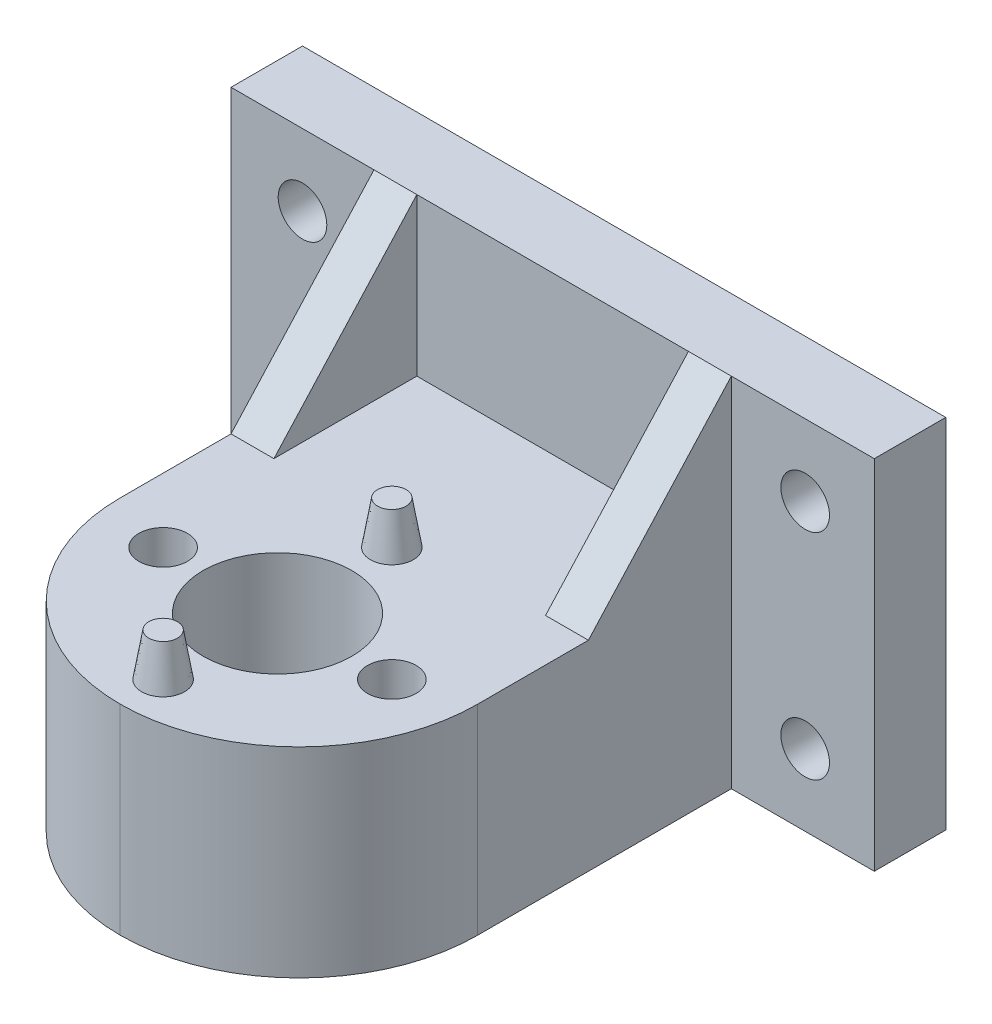
ISO-10303-21;
HEADER;
FILE_DESCRIPTION(('STEP AP214'),'2;1');
FILE_NAME('part.step','',(''),(''),'','','');
FILE_SCHEMA(('AUTOMOTIVE_DESIGN { 1 0 10303 214 1 1 1 1 }'));
ENDSEC;
DATA;
#1=APPLICATION_CONTEXT('core data for automotive mechanical design processes');
#2=APPLICATION_PROTOCOL_DEFINITION('international standard','automotive_design',2000,#1);
#3=PRODUCT_CONTEXT('',#1,'mechanical');
#4=PRODUCT('Part','Part','',(#3));
#5=PRODUCT_RELATED_PRODUCT_CATEGORY('part','',(#4));
#6=PRODUCT_DEFINITION_FORMATION('','',#4);
#7=PRODUCT_DEFINITION_CONTEXT('part definition',#1,'design');
#8=PRODUCT_DEFINITION('design','',#6,#7);
#9=PRODUCT_DEFINITION_SHAPE('','',#8);
#10=(LENGTH_UNIT() NAMED_UNIT(*) SI_UNIT(.MILLI.,.METRE.));
#11=(NAMED_UNIT(*) PLANE_ANGLE_UNIT() SI_UNIT($,.RADIAN.));
#12=(NAMED_UNIT(*) SI_UNIT($,.STERADIAN.) SOLID_ANGLE_UNIT());
#13=UNCERTAINTY_MEASURE_WITH_UNIT(LENGTH_MEASURE(1.E-05),#10,'distance_accuracy_value','');
#14=(GEOMETRIC_REPRESENTATION_CONTEXT(3) GLOBAL_UNCERTAINTY_ASSIGNED_CONTEXT((#13)) GLOBAL_UNIT_ASSIGNED_CONTEXT((#10,
#11,#12)) REPRESENTATION_CONTEXT('',''));
#15=CARTESIAN_POINT('',(0.,0.,0.));
#16=DIRECTION('',(0.,0.,1.));
#17=DIRECTION('',(1.,0.,0.));
#18=AXIS2_PLACEMENT_3D('',#15,#16,#17);
#19=CARTESIAN_POINT('',(0.,0.,5.));
#20=DIRECTION('',(0.,0.,1.));
#21=DIRECTION('',(1.,0.,0.));
#22=AXIS2_PLACEMENT_3D('',#19,#20,#21);
#23=PLANE('',#22);
#24=CARTESIAN_POINT('',(-93.9601678730371,215.923622409626,5.));
#25=DIRECTION('',(0.,0.,1.));
#26=DIRECTION('',(1.,0.,0.));
#27=AXIS2_PLACEMENT_3D('',#24,#25,#26);
#28=CIRCLE('',#27,1.7);
#29=CARTESIAN_POINT('',(-92.2601678730371,215.923622409626,5.));
#30=VERTEX_POINT('',#29);
#31=EDGE_CURVE('E175',#30,#30,#28,.T.);
#32=ORIENTED_EDGE('',*,*,#31,.F.);
#33=EDGE_LOOP('',(#32));
#34=FACE_BOUND('',#33,.T.);
#35=CARTESIAN_POINT('',(-93.9601678730371,230.923622409626,5.));
#36=DIRECTION('',(0.,0.,1.));
#37=DIRECTION('',(1.,0.,0.));
#38=AXIS2_PLACEMENT_3D('',#35,#36,#37);
#39=CIRCLE('',#38,1.7);
#40=CARTESIAN_POINT('',(-92.2601678730371,230.923622409626,5.));
#41=VERTEX_POINT('',#40);
#42=EDGE_CURVE('E178',#41,#41,#39,.T.);
#43=ORIENTED_EDGE('',*,*,#42,.F.);
#44=EDGE_LOOP('',(#43));
#45=FACE_BOUND('',#44,.T.);
#46=DIRECTION('',(1.,0.,0.));
#47=VECTOR('',#46,1.);
#48=CARTESIAN_POINT('',(0.,235.923622409626,5.));
#49=LINE('',#48,#47);
#50=CARTESIAN_POINT('',(-99.1237661659069,235.923622409626,5.));
#51=VERTEX_POINT('',#50);
#52=CARTESIAN_POINT('',(-89.1237661627145,235.923622409626,5.));
#53=VERTEX_POINT('',#52);
#54=EDGE_CURVE('E159',#51,#53,#49,.T.);
#55=ORIENTED_EDGE('',*,*,#54,.F.);
#56=DIRECTION('',(0.,-1.,0.));
#57=VECTOR('',#56,1.);
#58=CARTESIAN_POINT('',(-99.1237661659069,264.167252464479,5.));
#59=LINE('',#58,#57);
#60=CARTESIAN_POINT('',(-99.1237661659069,210.923622409626,5.));
#61=VERTEX_POINT('',#60);
#62=EDGE_CURVE('E254',#51,#61,#59,.T.);
#63=ORIENTED_EDGE('',*,*,#62,.T.);
#64=DIRECTION('',(1.,0.,0.));
#65=VECTOR('',#64,1.);
#66=CARTESIAN_POINT('',(0.,210.923622409626,5.));
#67=LINE('',#66,#65);
#68=CARTESIAN_POINT('',(-89.1237661627145,210.923622409626,5.));
#69=VERTEX_POINT('',#68);
#70=EDGE_CURVE('E168',#61,#69,#67,.T.);
#71=ORIENTED_EDGE('',*,*,#70,.T.);
#72=DIRECTION('',(0.,-1.,0.));
#73=VECTOR('',#72,1.);
#74=CARTESIAN_POINT('',(-89.1237661627145,0.,5.));
#75=LINE('',#74,#73);
#76=EDGE_CURVE('E172',#53,#69,#75,.T.);
#77=ORIENTED_EDGE('',*,*,#76,.F.);
#78=EDGE_LOOP('',(#55,#63,#71,#77));
#79=FACE_BOUND('',#78,.T.);
#80=ADVANCED_FACE('F34',(#34,#45,#79),#23,.T.);
#81=DIRECTION('',(-1.,0.,0.));
#82=VECTOR('',#81,1.);
#83=CARTESIAN_POINT('',(0.,224.923622409615,5.));
#84=LINE('',#83,#82);
#85=CARTESIAN_POINT('',(-102.123766165907,224.923622409615,5.));
#86=VERTEX_POINT('',#85);
#87=CARTESIAN_POINT('',(-121.123766165907,224.923622409615,5.));
#88=VERTEX_POINT('',#87);
#89=EDGE_CURVE('E302',#86,#88,#84,.T.);
#90=ORIENTED_EDGE('',*,*,#89,.F.);
#91=DIRECTION('',(0.,-1.,0.));
#92=VECTOR('',#91,1.);
#93=CARTESIAN_POINT('',(-102.123766165907,246.363928918536,5.));
#94=LINE('',#93,#92);
#95=CARTESIAN_POINT('',(-102.123766165907,235.923622409626,5.));
#96=VERTEX_POINT('',#95);
#97=EDGE_CURVE('E158',#96,#86,#94,.T.);
#98=ORIENTED_EDGE('',*,*,#97,.F.);
#99=CARTESIAN_POINT('',(-121.123766165907,235.923622409626,5.));
#100=VERTEX_POINT('',#99);
#101=EDGE_CURVE('E142',#100,#96,#49,.T.);
#102=ORIENTED_EDGE('',*,*,#101,.F.);
#103=DIRECTION('',(0.,-1.,0.));
#104=VECTOR('',#103,1.);
#105=CARTESIAN_POINT('',(-121.123766165907,246.363928918536,5.));
#106=LINE('',#105,#104);
#107=EDGE_CURVE('E150',#100,#88,#106,.T.);
#108=ORIENTED_EDGE('',*,*,#107,.T.);
#109=EDGE_LOOP('',(#90,#98,#102,#108));
#110=FACE_BOUND('',#109,.T.);
#111=ADVANCED_FACE('F156',(#110),#23,.T.);
#112=CARTESIAN_POINT('',(-111.623766165907,224.923622409615,24.2499999980671));
#113=DIRECTION('',(0.,1.,0.));
#114=DIRECTION('',(-0.622152501821474,0.,-0.782896075144895));
#115=AXIS2_PLACEMENT_3D('',#112,#113,#114);
#116=PLANE('',#115);
#117=CARTESIAN_POINT('',(-111.623766165898,224.923622409615,32.2499999980671));
#118=DIRECTION('',(0.,1.,0.));
#119=DIRECTION('',(0.,0.,1.));
#120=AXIS2_PLACEMENT_3D('',#117,#118,#119);
#121=CIRCLE('',#120,1.5);
#122=CARTESIAN_POINT('',(-111.623766165898,224.923622409615,33.7499999980671));
#123=VERTEX_POINT('',#122);
#124=EDGE_CURVE('E239',#123,#123,#121,.T.);
#125=ORIENTED_EDGE('',*,*,#124,.F.);
#126=EDGE_LOOP('',(#125));
#127=FACE_BOUND('',#126,.T.);
#128=CARTESIAN_POINT('',(-111.623766165898,224.923622409615,16.2499999980671));
#129=DIRECTION('',(0.,1.,0.));
#130=DIRECTION('',(0.,0.,1.));
#131=AXIS2_PLACEMENT_3D('',#128,#129,#130);
#132=CIRCLE('',#131,1.5);
#133=CARTESIAN_POINT('',(-111.623766165898,224.923622409615,17.7499999980671));
#134=VERTEX_POINT('',#133);
#135=EDGE_CURVE('E293',#134,#134,#132,.T.);
#136=ORIENTED_EDGE('',*,*,#135,.F.);
#137=EDGE_LOOP('',(#136));
#138=FACE_BOUND('',#137,.T.);
#139=CARTESIAN_POINT('',(-111.623766165907,224.923622409615,24.2499999980671));
#140=DIRECTION('',(0.,1.,0.));
#141=DIRECTION('',(0.,0.,1.));
#142=AXIS2_PLACEMENT_3D('',#139,#140,#141);
#143=CIRCLE('',#142,5.19999999999999);
#144=CARTESIAN_POINT('',(-111.623766165907,224.923622409615,29.4499999980671));
#145=VERTEX_POINT('',#144);
#146=EDGE_CURVE('E303',#145,#145,#143,.F.);
#147=ORIENTED_EDGE('',*,*,#146,.T.);
#148=EDGE_LOOP('',(#147));
#149=FACE_BOUND('',#148,.T.);
#150=CARTESIAN_POINT('',(-119.623766165907,224.923622409615,24.2499999980671));
#151=DIRECTION('',(0.,1.,0.));
#152=DIRECTION('',(0.,0.,1.));
#153=AXIS2_PLACEMENT_3D('',#150,#151,#152);
#154=CIRCLE('',#153,1.7);
#155=CARTESIAN_POINT('',(-119.623766165907,224.923622409615,25.9499999980671));
#156=VERTEX_POINT('',#155);
#157=EDGE_CURVE('E305',#156,#156,#154,.F.);
#158=ORIENTED_EDGE('',*,*,#157,.T.);
#159=EDGE_LOOP('',(#158));
#160=FACE_BOUND('',#159,.T.);
#161=CARTESIAN_POINT('',(-103.623766165907,224.923622409615,24.2499999980671));
#162=DIRECTION('',(0.,1.,0.));
#163=DIRECTION('',(0.,0.,1.));
#164=AXIS2_PLACEMENT_3D('',#161,#162,#163);
#165=CIRCLE('',#164,1.7);
#166=CARTESIAN_POINT('',(-103.623766165907,224.923622409615,25.9499999980671));
#167=VERTEX_POINT('',#166);
#168=EDGE_CURVE('E192',#167,#167,#165,.F.);
#169=ORIENTED_EDGE('',*,*,#168,.T.);
#170=EDGE_LOOP('',(#169));
#171=FACE_BOUND('',#170,.T.);
#172=DIRECTION('',(1.,0.,0.));
#173=VECTOR('',#172,1.);
#174=CARTESIAN_POINT('',(-99.1237661659069,224.923622409615,15.));
#175=LINE('',#174,#173);
#176=CARTESIAN_POINT('',(-102.123766165907,224.923622409615,15.));
#177=VERTEX_POINT('',#176);
#178=CARTESIAN_POINT('',(-99.1237661659069,224.923622409615,15.));
#179=VERTEX_POINT('',#178);
#180=EDGE_CURVE('E49',#177,#179,#175,.T.);
#181=ORIENTED_EDGE('',*,*,#180,.F.);
#182=DIRECTION('',(0.,0.,1.));
#183=VECTOR('',#182,1.);
#184=CARTESIAN_POINT('',(-102.123766165907,224.923622409615,5.));
#185=LINE('',#184,#183);
#186=EDGE_CURVE('E53',#86,#177,#185,.T.);
#187=ORIENTED_EDGE('',*,*,#186,.F.);
#188=ORIENTED_EDGE('',*,*,#89,.T.);
#189=DIRECTION('',(0.,0.,-1.));
#190=VECTOR('',#189,1.);
#191=CARTESIAN_POINT('',(-121.123766165907,224.923622409615,5.));
#192=LINE('',#191,#190);
#193=CARTESIAN_POINT('',(-121.123766165907,224.923622409615,15.));
#194=VERTEX_POINT('',#193);
#195=EDGE_CURVE('E152',#194,#88,#192,.T.);
#196=ORIENTED_EDGE('',*,*,#195,.F.);
#197=DIRECTION('',(1.,0.,0.));
#198=VECTOR('',#197,1.);
#199=CARTESIAN_POINT('',(-124.123766165907,224.923622409615,15.));
#200=LINE('',#199,#198);
#201=CARTESIAN_POINT('',(-124.123766165907,224.923622409615,15.));
#202=VERTEX_POINT('',#201);
#203=EDGE_CURVE('E130',#202,#194,#200,.T.);
#204=ORIENTED_EDGE('',*,*,#203,.F.);
#205=DIRECTION('',(0.,0.,-1.));
#206=VECTOR('',#205,1.);
#207=CARTESIAN_POINT('',(-124.123766165907,224.923622409615,0.));
#208=LINE('',#207,#206);
#209=CARTESIAN_POINT('',(-124.123766165907,224.923622409615,22.7499999980671));
#210=VERTEX_POINT('',#209);
#211=EDGE_CURVE('E291',#210,#202,#208,.T.);
#212=ORIENTED_EDGE('',*,*,#211,.F.);
#213=CARTESIAN_POINT('',(-111.623766165907,224.923622409615,22.7499999980671));
#214=DIRECTION('',(0.,1.,0.));
#215=DIRECTION('',(0.,0.,1.));
#216=AXIS2_PLACEMENT_3D('',#213,#214,#215);
#217=CIRCLE('',#216,12.5);
#218=CARTESIAN_POINT('',(-111.623766165907,224.923622409615,35.2499999980671));
#219=VERTEX_POINT('',#218);
#220=EDGE_CURVE('E232',#210,#219,#217,.T.);
#221=ORIENTED_EDGE('',*,*,#220,.T.);
#222=CARTESIAN_POINT('',(-111.623766165907,224.923622409615,22.7499999980671));
#223=DIRECTION('',(0.,1.,0.));
#224=DIRECTION('',(0.,0.,1.));
#225=AXIS2_PLACEMENT_3D('',#222,#223,#224);
#226=CIRCLE('',#225,12.5);
#227=CARTESIAN_POINT('',(-99.1237661659069,224.923622409615,22.7499999980671));
#228=VERTEX_POINT('',#227);
#229=EDGE_CURVE('E234',#219,#228,#226,.T.);
#230=ORIENTED_EDGE('',*,*,#229,.T.);
#231=DIRECTION('',(0.,0.,-1.));
#232=VECTOR('',#231,1.);
#233=CARTESIAN_POINT('',(-99.1237661659069,224.923622409615,0.));
#234=LINE('',#233,#232);
#235=EDGE_CURVE('E300',#228,#179,#234,.T.);
#236=ORIENTED_EDGE('',*,*,#235,.T.);
#237=EDGE_LOOP('',(#181,#187,#188,#196,#204,#212,#221,#230,#236));
#238=FACE_BOUND('',#237,.T.);
#239=ADVANCED_FACE('F321',(#127,#138,#149,#160,#171,#238),#116,.T.);
#240=CARTESIAN_POINT('',(-129.123766162715,230.923622409626,5.));
#241=DIRECTION('',(0.,0.,1.));
#242=DIRECTION('',(1.,0.,0.));
#243=AXIS2_PLACEMENT_3D('',#240,#241,#242);
#244=CIRCLE('',#243,1.70000000000001);
#245=CARTESIAN_POINT('',(-127.423766162715,230.923622409626,5.));
#246=VERTEX_POINT('',#245);
#247=EDGE_CURVE('E184',#246,#246,#244,.T.);
#248=ORIENTED_EDGE('',*,*,#247,.F.);
#249=EDGE_LOOP('',(#248));
#250=FACE_BOUND('',#249,.T.);
#251=CARTESIAN_POINT('',(-129.123766162715,215.923622409626,5.));
#252=DIRECTION('',(0.,0.,1.));
#253=DIRECTION('',(1.,0.,0.));
#254=AXIS2_PLACEMENT_3D('',#251,#252,#253);
#255=CIRCLE('',#254,1.70000000000001);
#256=CARTESIAN_POINT('',(-127.423766162715,215.923622409626,5.));
#257=VERTEX_POINT('',#256);
#258=EDGE_CURVE('E181',#257,#257,#255,.T.);
#259=ORIENTED_EDGE('',*,*,#258,.F.);
#260=EDGE_LOOP('',(#259));
#261=FACE_BOUND('',#260,.T.);
#262=DIRECTION('',(0.,-1.,0.));
#263=VECTOR('',#262,1.);
#264=CARTESIAN_POINT('',(-124.123766165907,264.167252464479,5.));
#265=LINE('',#264,#263);
#266=CARTESIAN_POINT('',(-124.123766165907,235.923622409626,5.));
#267=VERTEX_POINT('',#266);
#268=CARTESIAN_POINT('',(-124.123766165907,210.923622409626,5.));
#269=VERTEX_POINT('',#268);
#270=EDGE_CURVE('E165',#267,#269,#265,.T.);
#271=ORIENTED_EDGE('',*,*,#270,.F.);
#272=CARTESIAN_POINT('',(-134.123766162715,235.923622409626,5.));
#273=VERTEX_POINT('',#272);
#274=EDGE_CURVE('E145',#273,#267,#49,.T.);
#275=ORIENTED_EDGE('',*,*,#274,.F.);
#276=DIRECTION('',(0.,-1.,0.));
#277=VECTOR('',#276,1.);
#278=CARTESIAN_POINT('',(-134.123766162715,0.,5.));
#279=LINE('',#278,#277);
#280=CARTESIAN_POINT('',(-134.123766162715,210.923622409626,5.));
#281=VERTEX_POINT('',#280);
#282=EDGE_CURVE('E161',#273,#281,#279,.T.);
#283=ORIENTED_EDGE('',*,*,#282,.T.);
#284=EDGE_CURVE('E169',#281,#269,#67,.T.);
#285=ORIENTED_EDGE('',*,*,#284,.T.);
#286=EDGE_LOOP('',(#271,#275,#283,#285));
#287=FACE_BOUND('',#286,.T.);
#288=ADVANCED_FACE('F286',(#250,#261,#287),#23,.T.);
#289=CARTESIAN_POINT('',(0.,235.923622409626,5.));
#290=DIRECTION('',(0.,1.,0.));
#291=DIRECTION('',(0.,0.,1.));
#292=AXIS2_PLACEMENT_3D('',#289,#290,#291);
#293=PLANE('',#292);
#294=ORIENTED_EDGE('',*,*,#101,.T.);
#295=DIRECTION('',(1.,0.,0.));
#296=VECTOR('',#295,1.);
#297=CARTESIAN_POINT('',(-99.1237661659069,235.923622409626,5.));
#298=LINE('',#297,#296);
#299=EDGE_CURVE('E146',#96,#51,#298,.T.);
#300=ORIENTED_EDGE('',*,*,#299,.T.);
#301=ORIENTED_EDGE('',*,*,#54,.T.);
#302=DIRECTION('',(0.,0.,-1.));
#303=VECTOR('',#302,1.);
#304=CARTESIAN_POINT('',(-89.1237661627145,235.923622409626,5.));
#305=LINE('',#304,#303);
#306=CARTESIAN_POINT('',(-89.1237661627145,235.923622409626,0.));
#307=VERTEX_POINT('',#306);
#308=EDGE_CURVE('E187',#53,#307,#305,.T.);
#309=ORIENTED_EDGE('',*,*,#308,.T.);
#310=DIRECTION('',(1.,0.,0.));
#311=VECTOR('',#310,1.);
#312=CARTESIAN_POINT('',(0.,235.923622409626,0.));
#313=LINE('',#312,#311);
#314=CARTESIAN_POINT('',(-134.123766162715,235.923622409626,0.));
#315=VERTEX_POINT('',#314);
#316=EDGE_CURVE('E188',#315,#307,#313,.T.);
#317=ORIENTED_EDGE('',*,*,#316,.F.);
#318=DIRECTION('',(0.,0.,-1.));
#319=VECTOR('',#318,1.);
#320=CARTESIAN_POINT('',(-134.123766162715,235.923622409626,5.));
#321=LINE('',#320,#319);
#322=EDGE_CURVE('E217',#273,#315,#321,.T.);
#323=ORIENTED_EDGE('',*,*,#322,.F.);
#324=ORIENTED_EDGE('',*,*,#274,.T.);
#325=DIRECTION('',(1.,0.,0.));
#326=VECTOR('',#325,1.);
#327=CARTESIAN_POINT('',(-121.123766165907,235.923622409626,5.));
#328=LINE('',#327,#326);
#329=EDGE_CURVE('E129',#267,#100,#328,.T.);
#330=ORIENTED_EDGE('',*,*,#329,.T.);
#331=EDGE_LOOP('',(#294,#300,#301,#309,#317,#323,#324,#330));
#332=FACE_BOUND('',#331,.T.);
#333=ADVANCED_FACE('F139',(#332),#293,.T.);
#334=CARTESIAN_POINT('',(-134.123766162715,0.,5.));
#335=DIRECTION('',(1.,0.,0.));
#336=DIRECTION('',(0.,0.,-1.));
#337=AXIS2_PLACEMENT_3D('',#334,#335,#336);
#338=PLANE('',#337);
#339=DIRECTION('',(0.,-1.,0.));
#340=VECTOR('',#339,1.);
#341=CARTESIAN_POINT('',(-134.123766162715,0.,0.));
#342=LINE('',#341,#340);
#343=CARTESIAN_POINT('',(-134.123766162715,210.923622409626,0.));
#344=VERTEX_POINT('',#343);
#345=EDGE_CURVE('E191',#315,#344,#342,.T.);
#346=ORIENTED_EDGE('',*,*,#345,.T.);
#347=DIRECTION('',(0.,0.,-1.));
#348=VECTOR('',#347,1.);
#349=CARTESIAN_POINT('',(-134.123766162715,210.923622409626,5.));
#350=LINE('',#349,#348);
#351=EDGE_CURVE('E214',#281,#344,#350,.T.);
#352=ORIENTED_EDGE('',*,*,#351,.F.);
#353=ORIENTED_EDGE('',*,*,#282,.F.);
#354=ORIENTED_EDGE('',*,*,#322,.T.);
#355=EDGE_LOOP('',(#346,#352,#353,#354));
#356=FACE_BOUND('',#355,.T.);
#357=ADVANCED_FACE('F275',(#356),#338,.F.);
#358=CARTESIAN_POINT('',(0.,210.923622409626,5.));
#359=DIRECTION('',(0.,1.,0.));
#360=DIRECTION('',(0.,0.,1.));
#361=AXIS2_PLACEMENT_3D('',#358,#359,#360);
#362=PLANE('',#361);
#363=DIRECTION('',(0.,0.,-1.));
#364=VECTOR('',#363,1.);
#365=CARTESIAN_POINT('',(-99.1237661659069,210.923622409626,0.));
#366=LINE('',#365,#364);
#367=CARTESIAN_POINT('',(-99.1237661659069,210.923622409626,22.7499999980671));
#368=VERTEX_POINT('',#367);
#369=EDGE_CURVE('E258',#368,#61,#366,.T.);
#370=ORIENTED_EDGE('',*,*,#369,.F.);
#371=CARTESIAN_POINT('',(-111.623766165907,210.923622409626,22.7499999980671));
#372=DIRECTION('',(0.,1.,0.));
#373=DIRECTION('',(0.,0.,1.));
#374=AXIS2_PLACEMENT_3D('',#371,#372,#373);
#375=CIRCLE('',#374,12.5);
#376=CARTESIAN_POINT('',(-111.623766165907,210.923622409626,35.2499999980671));
#377=VERTEX_POINT('',#376);
#378=EDGE_CURVE('E230',#368,#377,#375,.F.);
#379=ORIENTED_EDGE('',*,*,#378,.T.);
#380=CARTESIAN_POINT('',(-111.623766165907,210.923622409626,22.7499999980671));
#381=DIRECTION('',(0.,1.,0.));
#382=DIRECTION('',(0.,0.,1.));
#383=AXIS2_PLACEMENT_3D('',#380,#381,#382);
#384=CIRCLE('',#383,12.5);
#385=CARTESIAN_POINT('',(-124.123766165907,210.923622409626,22.7499999980671));
#386=VERTEX_POINT('',#385);
#387=EDGE_CURVE('E228',#377,#386,#384,.F.);
#388=ORIENTED_EDGE('',*,*,#387,.T.);
#389=DIRECTION('',(0.,0.,-1.));
#390=VECTOR('',#389,1.);
#391=CARTESIAN_POINT('',(-124.123766165907,210.923622409626,0.));
#392=LINE('',#391,#390);
#393=EDGE_CURVE('E282',#386,#269,#392,.T.);
#394=ORIENTED_EDGE('',*,*,#393,.T.);
#395=ORIENTED_EDGE('',*,*,#284,.F.);
#396=ORIENTED_EDGE('',*,*,#351,.T.);
#397=DIRECTION('',(1.,0.,0.));
#398=VECTOR('',#397,1.);
#399=CARTESIAN_POINT('',(0.,210.923622409626,0.));
#400=LINE('',#399,#398);
#401=CARTESIAN_POINT('',(-89.1237661627145,210.923622409626,0.));
#402=VERTEX_POINT('',#401);
#403=EDGE_CURVE('E194',#344,#402,#400,.T.);
#404=ORIENTED_EDGE('',*,*,#403,.T.);
#405=DIRECTION('',(0.,0.,-1.));
#406=VECTOR('',#405,1.);
#407=CARTESIAN_POINT('',(-89.1237661627145,210.923622409626,5.));
#408=LINE('',#407,#406);
#409=EDGE_CURVE('E212',#69,#402,#408,.T.);
#410=ORIENTED_EDGE('',*,*,#409,.F.);
#411=ORIENTED_EDGE('',*,*,#70,.F.);
#412=EDGE_LOOP('',(#370,#379,#388,#394,#395,#396,#404,#410,#411));
#413=FACE_BOUND('',#412,.T.);
#414=CARTESIAN_POINT('',(-111.623766165907,210.923622409626,24.2499999980671));
#415=DIRECTION('',(0.,-1.,0.));
#416=DIRECTION('',(0.,0.,-1.));
#417=AXIS2_PLACEMENT_3D('',#414,#415,#416);
#418=CIRCLE('',#417,5.19999999999999);
#419=CARTESIAN_POINT('',(-111.623766165907,210.923622409626,19.0499999980671));
#420=VERTEX_POINT('',#419);
#421=EDGE_CURVE('E309',#420,#420,#418,.T.);
#422=ORIENTED_EDGE('',*,*,#421,.F.);
#423=EDGE_LOOP('',(#422));
#424=FACE_BOUND('',#423,.T.);
#425=CARTESIAN_POINT('',(-103.623766165907,210.923622409626,24.2499999980671));
#426=DIRECTION('',(0.,-1.,0.));
#427=DIRECTION('',(0.,0.,-1.));
#428=AXIS2_PLACEMENT_3D('',#425,#426,#427);
#429=CIRCLE('',#428,1.7);
#430=CARTESIAN_POINT('',(-103.623766165907,210.923622409626,22.5499999980671));
#431=VERTEX_POINT('',#430);
#432=EDGE_CURVE('E261',#431,#431,#429,.T.);
#433=ORIENTED_EDGE('',*,*,#432,.F.);
#434=EDGE_LOOP('',(#433));
#435=FACE_BOUND('',#434,.T.);
#436=CARTESIAN_POINT('',(-119.623766165907,210.923622409626,24.2499999980671));
#437=DIRECTION('',(0.,-1.,0.));
#438=DIRECTION('',(0.,0.,-1.));
#439=AXIS2_PLACEMENT_3D('',#436,#437,#438);
#440=CIRCLE('',#439,1.7);
#441=CARTESIAN_POINT('',(-119.623766165907,210.923622409626,22.5499999980671));
#442=VERTEX_POINT('',#441);
#443=EDGE_CURVE('E306',#442,#442,#440,.T.);
#444=ORIENTED_EDGE('',*,*,#443,.F.);
#445=EDGE_LOOP('',(#444));
#446=FACE_BOUND('',#445,.T.);
#447=ADVANCED_FACE('F279',(#413,#424,#435,#446),#362,.F.);
#448=CARTESIAN_POINT('',(-129.123766162715,215.923622409626,5.));
#449=DIRECTION('',(0.,0.,-1.));
#450=DIRECTION('',(-1.,0.,0.));
#451=AXIS2_PLACEMENT_3D('',#448,#449,#450);
#452=CYLINDRICAL_SURFACE('',#451,1.70000000000001);
#453=ORIENTED_EDGE('',*,*,#258,.T.);
#454=EDGE_LOOP('',(#453));
#455=FACE_BOUND('',#454,.T.);
#456=CARTESIAN_POINT('',(-129.123766162715,215.923622409626,0.));
#457=DIRECTION('',(0.,0.,1.));
#458=DIRECTION('',(1.,0.,0.));
#459=AXIS2_PLACEMENT_3D('',#456,#457,#458);
#460=CIRCLE('',#459,1.70000000000001);
#461=CARTESIAN_POINT('',(-127.423766162715,215.923622409626,0.));
#462=VERTEX_POINT('',#461);
#463=EDGE_CURVE('E206',#462,#462,#460,.T.);
#464=ORIENTED_EDGE('',*,*,#463,.F.);
#465=EDGE_LOOP('',(#464));
#466=FACE_BOUND('',#465,.T.);
#467=ADVANCED_FACE('F362',(#455,#466),#452,.F.);
#468=CARTESIAN_POINT('',(-93.9601678730371,230.923622409626,5.));
#469=DIRECTION('',(0.,0.,-1.));
#470=DIRECTION('',(-1.,0.,0.));
#471=AXIS2_PLACEMENT_3D('',#468,#469,#470);
#472=CYLINDRICAL_SURFACE('',#471,1.7);
#473=ORIENTED_EDGE('',*,*,#42,.T.);
#474=EDGE_LOOP('',(#473));
#475=FACE_BOUND('',#474,.T.);
#476=CARTESIAN_POINT('',(-93.9601678730371,230.923622409626,0.));
#477=DIRECTION('',(0.,0.,1.));
#478=DIRECTION('',(1.,0.,0.));
#479=AXIS2_PLACEMENT_3D('',#476,#477,#478);
#480=CIRCLE('',#479,1.7);
#481=CARTESIAN_POINT('',(-92.2601678730371,230.923622409626,0.));
#482=VERTEX_POINT('',#481);
#483=EDGE_CURVE('E203',#482,#482,#480,.T.);
#484=ORIENTED_EDGE('',*,*,#483,.F.);
#485=EDGE_LOOP('',(#484));
#486=FACE_BOUND('',#485,.T.);
#487=ADVANCED_FACE('F365',(#475,#486),#472,.F.);
#488=CARTESIAN_POINT('',(-93.9601678730371,215.923622409626,5.));
#489=DIRECTION('',(0.,0.,-1.));
#490=DIRECTION('',(-1.,0.,0.));
#491=AXIS2_PLACEMENT_3D('',#488,#489,#490);
#492=CYLINDRICAL_SURFACE('',#491,1.7);
#493=ORIENTED_EDGE('',*,*,#31,.T.);
#494=EDGE_LOOP('',(#493));
#495=FACE_BOUND('',#494,.T.);
#496=CARTESIAN_POINT('',(-93.9601678730371,215.923622409626,0.));
#497=DIRECTION('',(0.,0.,1.));
#498=DIRECTION('',(1.,0.,0.));
#499=AXIS2_PLACEMENT_3D('',#496,#497,#498);
#500=CIRCLE('',#499,1.7);
#501=CARTESIAN_POINT('',(-92.2601678730371,215.923622409626,0.));
#502=VERTEX_POINT('',#501);
#503=EDGE_CURVE('E200',#502,#502,#500,.T.);
#504=ORIENTED_EDGE('',*,*,#503,.F.);
#505=EDGE_LOOP('',(#504));
#506=FACE_BOUND('',#505,.T.);
#507=ADVANCED_FACE('F380',(#495,#506),#492,.F.);
#508=CARTESIAN_POINT('',(-89.1237661627145,0.,5.));
#509=DIRECTION('',(1.,0.,0.));
#510=DIRECTION('',(0.,0.,-1.));
#511=AXIS2_PLACEMENT_3D('',#508,#509,#510);
#512=PLANE('',#511);
#513=DIRECTION('',(0.,-1.,0.));
#514=VECTOR('',#513,1.);
#515=CARTESIAN_POINT('',(-89.1237661627145,0.,0.));
#516=LINE('',#515,#514);
#517=EDGE_CURVE('E197',#307,#402,#516,.T.);
#518=ORIENTED_EDGE('',*,*,#517,.F.);
#519=ORIENTED_EDGE('',*,*,#308,.F.);
#520=ORIENTED_EDGE('',*,*,#76,.T.);
#521=ORIENTED_EDGE('',*,*,#409,.T.);
#522=EDGE_LOOP('',(#518,#519,#520,#521));
#523=FACE_BOUND('',#522,.T.);
#524=ADVANCED_FACE('F266',(#523),#512,.T.);
#525=CARTESIAN_POINT('',(-129.123766162715,230.923622409626,5.));
#526=DIRECTION('',(0.,0.,-1.));
#527=DIRECTION('',(-1.,0.,0.));
#528=AXIS2_PLACEMENT_3D('',#525,#526,#527);
#529=CYLINDRICAL_SURFACE('',#528,1.70000000000001);
#530=ORIENTED_EDGE('',*,*,#247,.T.);
#531=EDGE_LOOP('',(#530));
#532=FACE_BOUND('',#531,.T.);
#533=CARTESIAN_POINT('',(-129.123766162715,230.923622409626,0.));
#534=DIRECTION('',(0.,0.,1.));
#535=DIRECTION('',(1.,0.,0.));
#536=AXIS2_PLACEMENT_3D('',#533,#534,#535);
#537=CIRCLE('',#536,1.70000000000001);
#538=CARTESIAN_POINT('',(-127.423766162715,230.923622409626,0.));
#539=VERTEX_POINT('',#538);
#540=EDGE_CURVE('E162',#539,#539,#537,.T.);
#541=ORIENTED_EDGE('',*,*,#540,.F.);
#542=EDGE_LOOP('',(#541));
#543=FACE_BOUND('',#542,.T.);
#544=ADVANCED_FACE('F371',(#532,#543),#529,.F.);
#545=CARTESIAN_POINT('',(0.,0.,0.));
#546=DIRECTION('',(0.,0.,1.));
#547=DIRECTION('',(1.,0.,0.));
#548=AXIS2_PLACEMENT_3D('',#545,#546,#547);
#549=PLANE('',#548);
#550=ORIENTED_EDGE('',*,*,#316,.T.);
#551=ORIENTED_EDGE('',*,*,#517,.T.);
#552=ORIENTED_EDGE('',*,*,#403,.F.);
#553=ORIENTED_EDGE('',*,*,#345,.F.);
#554=EDGE_LOOP('',(#550,#551,#552,#553));
#555=FACE_BOUND('',#554,.T.);
#556=ORIENTED_EDGE('',*,*,#503,.T.);
#557=EDGE_LOOP('',(#556));
#558=FACE_BOUND('',#557,.T.);
#559=ORIENTED_EDGE('',*,*,#483,.T.);
#560=EDGE_LOOP('',(#559));
#561=FACE_BOUND('',#560,.T.);
#562=ORIENTED_EDGE('',*,*,#463,.T.);
#563=EDGE_LOOP('',(#562));
#564=FACE_BOUND('',#563,.T.);
#565=ORIENTED_EDGE('',*,*,#540,.T.);
#566=EDGE_LOOP('',(#565));
#567=FACE_BOUND('',#566,.T.);
#568=ADVANCED_FACE('F270',(#555,#558,#561,#564,#567),#549,.F.);
#569=CARTESIAN_POINT('',(-124.123766165907,264.167252464479,0.));
#570=DIRECTION('',(-1.,0.,0.));
#571=DIRECTION('',(0.,0.,1.));
#572=AXIS2_PLACEMENT_3D('',#569,#570,#571);
#573=PLANE('',#572);
#574=ORIENTED_EDGE('',*,*,#211,.T.);
#575=DIRECTION('',(0.,0.739940073395946,-0.672672793996311));
#576=VECTOR('',#575,1.);
#577=CARTESIAN_POINT('',(-124.123766165907,253.876017145541,-11.320358850832));
#578=LINE('',#577,#576);
#579=EDGE_CURVE('E11',#202,#267,#578,.T.);
#580=ORIENTED_EDGE('',*,*,#579,.T.);
#581=ORIENTED_EDGE('',*,*,#270,.T.);
#582=ORIENTED_EDGE('',*,*,#393,.F.);
#583=DIRECTION('',(0.,-1.,0.));
#584=VECTOR('',#583,1.);
#585=CARTESIAN_POINT('',(-124.123766165907,224.923622409615,22.7499999980671));
#586=LINE('',#585,#584);
#587=EDGE_CURVE('E147',#386,#210,#586,.F.);
#588=ORIENTED_EDGE('',*,*,#587,.T.);
#589=EDGE_LOOP('',(#574,#580,#581,#582,#588));
#590=FACE_BOUND('',#589,.T.);
#591=ADVANCED_FACE('F289',(#590),#573,.T.);
#592=CARTESIAN_POINT('',(-99.1237661659069,264.167252464479,0.));
#593=DIRECTION('',(-1.,0.,0.));
#594=DIRECTION('',(0.,0.,1.));
#595=AXIS2_PLACEMENT_3D('',#592,#593,#594);
#596=PLANE('',#595);
#597=ORIENTED_EDGE('',*,*,#62,.F.);
#598=DIRECTION('',(0.,-0.739940073395946,0.672672793996311));
#599=VECTOR('',#598,1.);
#600=CARTESIAN_POINT('',(-99.1237661659069,235.923622409626,5.));
#601=LINE('',#600,#599);
#602=EDGE_CURVE('E242',#51,#179,#601,.T.);
#603=ORIENTED_EDGE('',*,*,#602,.T.);
#604=ORIENTED_EDGE('',*,*,#235,.F.);
#605=DIRECTION('',(0.,-1.,0.));
#606=VECTOR('',#605,1.);
#607=CARTESIAN_POINT('',(-99.1237661659069,264.167252464479,22.7499999980671));
#608=LINE('',#607,#606);
#609=EDGE_CURVE('E225',#228,#368,#608,.T.);
#610=ORIENTED_EDGE('',*,*,#609,.T.);
#611=ORIENTED_EDGE('',*,*,#369,.T.);
#612=EDGE_LOOP('',(#597,#603,#604,#610,#611));
#613=FACE_BOUND('',#612,.T.);
#614=ADVANCED_FACE('F255',(#613),#596,.F.);
#615=CARTESIAN_POINT('',(-103.623766165907,264.167252464479,24.2499999980671));
#616=DIRECTION('',(0.,-1.,0.));
#617=DIRECTION('',(0.,0.,-1.));
#618=AXIS2_PLACEMENT_3D('',#615,#616,#617);
#619=CYLINDRICAL_SURFACE('',#618,1.7);
#620=ORIENTED_EDGE('',*,*,#432,.T.);
#621=EDGE_LOOP('',(#620));
#622=FACE_BOUND('',#621,.T.);
#623=ORIENTED_EDGE('',*,*,#168,.F.);
#624=EDGE_LOOP('',(#623));
#625=FACE_BOUND('',#624,.T.);
#626=ADVANCED_FACE('F337',(#622,#625),#619,.F.);
#627=CARTESIAN_POINT('',(-111.623766165907,264.167252464479,24.2499999980671));
#628=DIRECTION('',(0.,-1.,0.));
#629=DIRECTION('',(0.,0.,-1.));
#630=AXIS2_PLACEMENT_3D('',#627,#628,#629);
#631=CYLINDRICAL_SURFACE('',#630,5.19999999999999);
#632=ORIENTED_EDGE('',*,*,#421,.T.);
#633=EDGE_LOOP('',(#632));
#634=FACE_BOUND('',#633,.T.);
#635=ORIENTED_EDGE('',*,*,#146,.F.);
#636=EDGE_LOOP('',(#635));
#637=FACE_BOUND('',#636,.T.);
#638=ADVANCED_FACE('F327',(#634,#637),#631,.F.);
#639=CARTESIAN_POINT('',(-119.623766165907,264.167252464479,24.2499999980671));
#640=DIRECTION('',(0.,-1.,0.));
#641=DIRECTION('',(0.,0.,-1.));
#642=AXIS2_PLACEMENT_3D('',#639,#640,#641);
#643=CYLINDRICAL_SURFACE('',#642,1.7);
#644=ORIENTED_EDGE('',*,*,#443,.T.);
#645=EDGE_LOOP('',(#644));
#646=FACE_BOUND('',#645,.T.);
#647=ORIENTED_EDGE('',*,*,#157,.F.);
#648=EDGE_LOOP('',(#647));
#649=FACE_BOUND('',#648,.T.);
#650=ADVANCED_FACE('F324',(#646,#649),#643,.F.);
#651=CARTESIAN_POINT('',(0.,227.923622409615,0.));
#652=DIRECTION('',(0.,1.,0.));
#653=DIRECTION('',(0.,0.,1.));
#654=AXIS2_PLACEMENT_3D('',#651,#652,#653);
#655=PLANE('',#654);
#656=CARTESIAN_POINT('',(-111.623766165898,227.923622409615,16.2499999980671));
#657=DIRECTION('',(0.,1.,0.));
#658=DIRECTION('',(0.,0.,1.));
#659=AXIS2_PLACEMENT_3D('',#656,#657,#658);
#660=CIRCLE('',#659,0.999999999999994);
#661=CARTESIAN_POINT('',(-111.623766165898,227.923622409615,17.2499999980671));
#662=VERTEX_POINT('',#661);
#663=EDGE_CURVE('E222',#662,#662,#660,.T.);
#664=ORIENTED_EDGE('',*,*,#663,.T.);
#665=EDGE_LOOP('',(#664));
#666=FACE_BOUND('',#665,.T.);
#667=ADVANCED_FACE('F326',(#666),#655,.T.);
#668=CARTESIAN_POINT('',(0.,227.923622409615,0.));
#669=DIRECTION('',(0.,1.,0.));
#670=DIRECTION('',(0.,0.,1.));
#671=AXIS2_PLACEMENT_3D('',#668,#669,#670);
#672=PLANE('',#671);
#673=CARTESIAN_POINT('',(-111.623766165898,227.923622409615,32.2499999980671));
#674=DIRECTION('',(0.,1.,0.));
#675=DIRECTION('',(0.,0.,1.));
#676=AXIS2_PLACEMENT_3D('',#673,#674,#675);
#677=CIRCLE('',#676,1.);
#678=CARTESIAN_POINT('',(-111.623766165898,227.923622409615,33.2499999980671));
#679=VERTEX_POINT('',#678);
#680=EDGE_CURVE('E219',#679,#679,#677,.T.);
#681=ORIENTED_EDGE('',*,*,#680,.T.);
#682=EDGE_LOOP('',(#681));
#683=FACE_BOUND('',#682,.T.);
#684=ADVANCED_FACE('F334',(#683),#672,.T.);
#685=CARTESIAN_POINT('',(-111.623766165898,227.923622409615,32.2499999980671));
#686=DIRECTION('',(0.,-1.,0.));
#687=DIRECTION('',(0.,0.,-1.));
#688=AXIS2_PLACEMENT_3D('',#685,#686,#687);
#689=CONICAL_SURFACE('',#688,1.,0.165148677414623);
#690=ORIENTED_EDGE('',*,*,#124,.T.);
#691=EDGE_LOOP('',(#690));
#692=FACE_BOUND('',#691,.T.);
#693=ORIENTED_EDGE('',*,*,#680,.F.);
#694=EDGE_LOOP('',(#693));
#695=FACE_BOUND('',#694,.T.);
#696=ADVANCED_FACE('F393',(#692,#695),#689,.T.);
#697=CARTESIAN_POINT('',(-111.623766165898,227.923622409615,16.2499999980671));
#698=DIRECTION('',(0.,-1.,0.));
#699=DIRECTION('',(0.,0.,-1.));
#700=AXIS2_PLACEMENT_3D('',#697,#698,#699);
#701=CONICAL_SURFACE('',#700,0.999999999999994,0.165148677414625);
#702=ORIENTED_EDGE('',*,*,#135,.T.);
#703=EDGE_LOOP('',(#702));
#704=FACE_BOUND('',#703,.T.);
#705=ORIENTED_EDGE('',*,*,#663,.F.);
#706=EDGE_LOOP('',(#705));
#707=FACE_BOUND('',#706,.T.);
#708=ADVANCED_FACE('F396',(#704,#707),#701,.T.);
#709=CARTESIAN_POINT('',(-111.623766165907,264.167252464479,22.7499999980671));
#710=DIRECTION('',(0.,1.,0.));
#711=DIRECTION('',(0.,0.,1.));
#712=AXIS2_PLACEMENT_3D('',#709,#710,#711);
#713=CYLINDRICAL_SURFACE('',#712,12.5);
#714=DIRECTION('',(0.,-1.,0.));
#715=VECTOR('',#714,1.);
#716=CARTESIAN_POINT('',(-111.623766165907,210.923622409626,35.2499999980671));
#717=LINE('',#716,#715);
#718=EDGE_CURVE('E237',#219,#377,#717,.T.);
#719=ORIENTED_EDGE('',*,*,#718,.F.);
#720=ORIENTED_EDGE('',*,*,#220,.F.);
#721=ORIENTED_EDGE('',*,*,#587,.F.);
#722=ORIENTED_EDGE('',*,*,#387,.F.);
#723=EDGE_LOOP('',(#719,#720,#721,#722));
#724=FACE_BOUND('',#723,.T.);
#725=ADVANCED_FACE('F400',(#724),#713,.T.);
#726=CARTESIAN_POINT('',(-111.623766165907,264.167252464479,22.7499999980671));
#727=DIRECTION('',(0.,-1.,0.));
#728=DIRECTION('',(0.,0.,-1.));
#729=AXIS2_PLACEMENT_3D('',#726,#727,#728);
#730=CYLINDRICAL_SURFACE('',#729,12.5);
#731=ORIENTED_EDGE('',*,*,#229,.F.);
#732=ORIENTED_EDGE('',*,*,#718,.T.);
#733=ORIENTED_EDGE('',*,*,#378,.F.);
#734=ORIENTED_EDGE('',*,*,#609,.F.);
#735=EDGE_LOOP('',(#731,#732,#733,#734));
#736=FACE_BOUND('',#735,.T.);
#737=ADVANCED_FACE('F402',(#736),#730,.T.);
#738=CARTESIAN_POINT('',(-121.123766165907,246.363928918536,5.));
#739=DIRECTION('',(-1.,0.,0.));
#740=DIRECTION('',(0.,0.,1.));
#741=AXIS2_PLACEMENT_3D('',#738,#739,#740);
#742=PLANE('',#741);
#743=ORIENTED_EDGE('',*,*,#107,.F.);
#744=DIRECTION('',(0.,-0.739940073395946,0.672672793996311));
#745=VECTOR('',#744,1.);
#746=CARTESIAN_POINT('',(-121.123766165907,235.923622409626,5.));
#747=LINE('',#746,#745);
#748=EDGE_CURVE('E42',#100,#194,#747,.T.);
#749=ORIENTED_EDGE('',*,*,#748,.T.);
#750=ORIENTED_EDGE('',*,*,#195,.T.);
#751=EDGE_LOOP('',(#743,#749,#750));
#752=FACE_BOUND('',#751,.T.);
#753=ADVANCED_FACE('F151',(#752),#742,.F.);
#754=CARTESIAN_POINT('',(-102.123766165907,246.363928918536,5.));
#755=DIRECTION('',(1.,0.,0.));
#756=DIRECTION('',(0.,0.,-1.));
#757=AXIS2_PLACEMENT_3D('',#754,#755,#756);
#758=PLANE('',#757);
#759=ORIENTED_EDGE('',*,*,#186,.T.);
#760=DIRECTION('',(0.,0.739940073395946,-0.672672793996311));
#761=VECTOR('',#760,1.);
#762=CARTESIAN_POINT('',(-102.123766165907,235.923622409626,5.));
#763=LINE('',#762,#761);
#764=EDGE_CURVE('E135',#177,#96,#763,.T.);
#765=ORIENTED_EDGE('',*,*,#764,.T.);
#766=ORIENTED_EDGE('',*,*,#97,.T.);
#767=EDGE_LOOP('',(#759,#765,#766));
#768=FACE_BOUND('',#767,.T.);
#769=ADVANCED_FACE('F246',(#768),#758,.F.);
#770=CARTESIAN_POINT('',(0.,235.923622409626,5.));
#771=DIRECTION('',(0.,0.67267279399631,0.739940073395945));
#772=DIRECTION('',(-1.,0.,0.));
#773=AXIS2_PLACEMENT_3D('',#770,#771,#772);
#774=PLANE('',#773);
#775=ORIENTED_EDGE('',*,*,#764,.F.);
#776=ORIENTED_EDGE('',*,*,#180,.T.);
#777=ORIENTED_EDGE('',*,*,#602,.F.);
#778=ORIENTED_EDGE('',*,*,#299,.F.);
#779=EDGE_LOOP('',(#775,#776,#777,#778));
#780=FACE_BOUND('',#779,.T.);
#781=ADVANCED_FACE('F248',(#780),#774,.T.);
#782=CARTESIAN_POINT('',(0.,235.923622409626,5.));
#783=DIRECTION('',(0.,0.67267279399631,0.739940073395945));
#784=DIRECTION('',(-1.,0.,0.));
#785=AXIS2_PLACEMENT_3D('',#782,#783,#784);
#786=PLANE('',#785);
#787=ORIENTED_EDGE('',*,*,#579,.F.);
#788=ORIENTED_EDGE('',*,*,#203,.T.);
#789=ORIENTED_EDGE('',*,*,#748,.F.);
#790=ORIENTED_EDGE('',*,*,#329,.F.);
#791=EDGE_LOOP('',(#787,#788,#789,#790));
#792=FACE_BOUND('',#791,.T.);
#793=ADVANCED_FACE('F36',(#792),#786,.T.);
#794=CLOSED_SHELL('',(#80,#111,#239,#288,#333,#357,#447,#467,#487,#507,#524,#544,#568,#591,#614,
#626,#638,#650,#667,#684,#696,#708,#725,#737,#753,#769,#781,#793));
#795=MANIFOLD_SOLID_BREP('B2',#794);
#796=ADVANCED_BREP_SHAPE_REPRESENTATION('',(#18,#795),#14);
#797=SHAPE_DEFINITION_REPRESENTATION(#9,#796);
ENDSEC;
END-ISO-10303-21;
